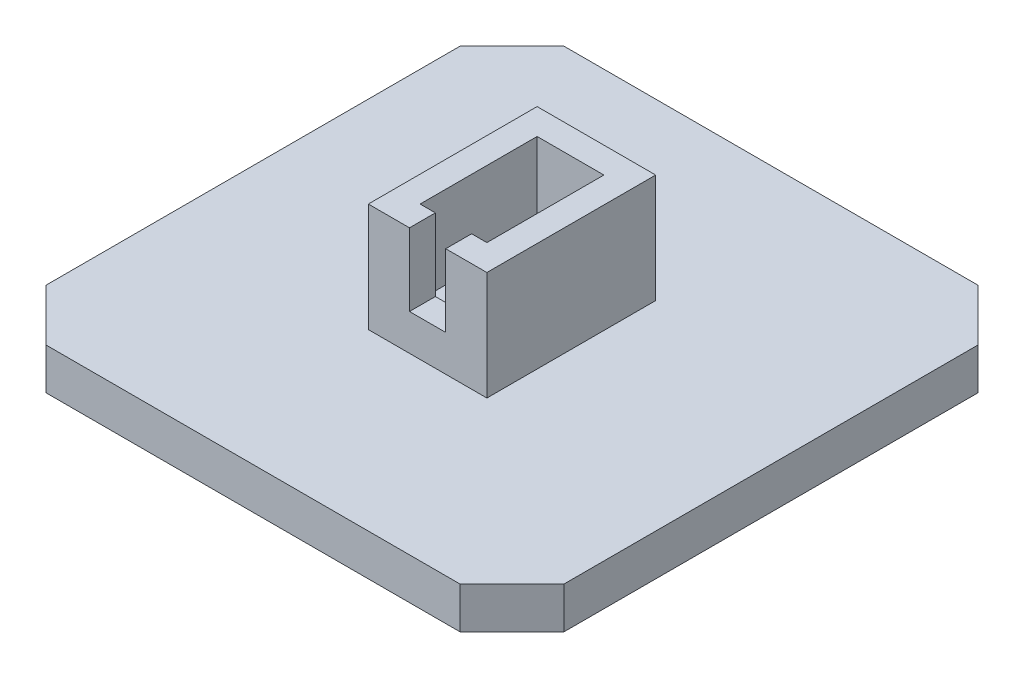
ISO-10303-21;
HEADER;
FILE_DESCRIPTION(('STEP AP214'),'2;1');
FILE_NAME('part.step','',(''),(''),'','','');
FILE_SCHEMA(('AUTOMOTIVE_DESIGN { 1 0 10303 214 1 1 1 1 }'));
ENDSEC;
DATA;
#1=APPLICATION_CONTEXT('core data for automotive mechanical design processes');
#2=APPLICATION_PROTOCOL_DEFINITION('international standard','automotive_design',2000,#1);
#3=PRODUCT_CONTEXT('',#1,'mechanical');
#4=PRODUCT('Part','Part','',(#3));
#5=PRODUCT_RELATED_PRODUCT_CATEGORY('part','',(#4));
#6=PRODUCT_DEFINITION_FORMATION('','',#4);
#7=PRODUCT_DEFINITION_CONTEXT('part definition',#1,'design');
#8=PRODUCT_DEFINITION('design','',#6,#7);
#9=PRODUCT_DEFINITION_SHAPE('','',#8);
#10=(LENGTH_UNIT() NAMED_UNIT(*) SI_UNIT(.MILLI.,.METRE.));
#11=(NAMED_UNIT(*) PLANE_ANGLE_UNIT() SI_UNIT($,.RADIAN.));
#12=(NAMED_UNIT(*) SI_UNIT($,.STERADIAN.) SOLID_ANGLE_UNIT());
#13=UNCERTAINTY_MEASURE_WITH_UNIT(LENGTH_MEASURE(1.E-05),#10,'distance_accuracy_value','');
#14=(GEOMETRIC_REPRESENTATION_CONTEXT(3) GLOBAL_UNCERTAINTY_ASSIGNED_CONTEXT((#13)) GLOBAL_UNIT_ASSIGNED_CONTEXT((#10,
#11,#12)) REPRESENTATION_CONTEXT('',''));
#15=CARTESIAN_POINT('',(0.,0.,0.));
#16=DIRECTION('',(0.,0.,1.));
#17=DIRECTION('',(1.,0.,0.));
#18=AXIS2_PLACEMENT_3D('',#15,#16,#17);
#19=CARTESIAN_POINT('',(6.45,7.99999999999999,11.3));
#20=DIRECTION('',(0.,-1.,0.));
#21=DIRECTION('',(0.,0.,-1.));
#22=AXIS2_PLACEMENT_3D('',#19,#20,#21);
#23=PLANE('',#22);
#24=DIRECTION('',(-1.,0.,0.));
#25=VECTOR('',#24,1.);
#26=CARTESIAN_POINT('',(6.45,7.99999999999999,16.3));
#27=LINE('',#26,#25);
#28=CARTESIAN_POINT('',(-3.5,7.99999999999999,16.3));
#29=VERTEX_POINT('',#28);
#30=CARTESIAN_POINT('',(-11.45,7.99999999999999,16.3));
#31=VERTEX_POINT('',#30);
#32=EDGE_CURVE('E201',#29,#31,#27,.T.);
#33=ORIENTED_EDGE('',*,*,#32,.F.);
#34=DIRECTION('',(0.,0.,-1.));
#35=VECTOR('',#34,1.);
#36=CARTESIAN_POINT('',(-3.5,7.99999999999999,16.301));
#37=LINE('',#36,#35);
#38=CARTESIAN_POINT('',(-3.5,7.99999999999999,11.3));
#39=VERTEX_POINT('',#38);
#40=EDGE_CURVE('E293',#29,#39,#37,.T.);
#41=ORIENTED_EDGE('',*,*,#40,.T.);
#42=DIRECTION('',(-1.,0.,0.));
#43=VECTOR('',#42,1.);
#44=CARTESIAN_POINT('',(6.45,7.99999999999999,11.3));
#45=LINE('',#44,#43);
#46=CARTESIAN_POINT('',(-6.45,7.99999999999999,11.3));
#47=VERTEX_POINT('',#46);
#48=EDGE_CURVE('E329',#39,#47,#45,.T.);
#49=ORIENTED_EDGE('',*,*,#48,.T.);
#50=DIRECTION('',(0.,0.,1.));
#51=VECTOR('',#50,1.);
#52=CARTESIAN_POINT('',(-6.45,7.99999999999999,11.3));
#53=LINE('',#52,#51);
#54=CARTESIAN_POINT('',(-6.45,7.99999999999999,-11.3));
#55=VERTEX_POINT('',#54);
#56=EDGE_CURVE('E317',#55,#47,#53,.T.);
#57=ORIENTED_EDGE('',*,*,#56,.F.);
#58=DIRECTION('',(-1.,0.,0.));
#59=VECTOR('',#58,1.);
#60=CARTESIAN_POINT('',(6.45,7.99999999999999,-11.3));
#61=LINE('',#60,#59);
#62=CARTESIAN_POINT('',(6.45,7.99999999999999,-11.3));
#63=VERTEX_POINT('',#62);
#64=EDGE_CURVE('E331',#63,#55,#61,.T.);
#65=ORIENTED_EDGE('',*,*,#64,.F.);
#66=DIRECTION('',(0.,0.,1.));
#67=VECTOR('',#66,1.);
#68=CARTESIAN_POINT('',(6.45,7.99999999999999,11.3));
#69=LINE('',#68,#67);
#70=CARTESIAN_POINT('',(6.45,7.99999999999999,11.3));
#71=VERTEX_POINT('',#70);
#72=EDGE_CURVE('E306',#63,#71,#69,.T.);
#73=ORIENTED_EDGE('',*,*,#72,.T.);
#74=CARTESIAN_POINT('',(3.5,7.99999999999999,11.3));
#75=VERTEX_POINT('',#74);
#76=EDGE_CURVE('E332',#71,#75,#45,.T.);
#77=ORIENTED_EDGE('',*,*,#76,.T.);
#78=DIRECTION('',(0.,0.,-1.));
#79=VECTOR('',#78,1.);
#80=CARTESIAN_POINT('',(3.5,7.99999999999999,16.301));
#81=LINE('',#80,#79);
#82=CARTESIAN_POINT('',(3.5,7.99999999999999,16.3));
#83=VERTEX_POINT('',#82);
#84=EDGE_CURVE('E297',#83,#75,#81,.T.);
#85=ORIENTED_EDGE('',*,*,#84,.F.);
#86=CARTESIAN_POINT('',(11.45,7.99999999999999,16.3));
#87=VERTEX_POINT('',#86);
#88=EDGE_CURVE('E215',#87,#83,#27,.T.);
#89=ORIENTED_EDGE('',*,*,#88,.F.);
#90=DIRECTION('',(0.,0.,1.));
#91=VECTOR('',#90,1.);
#92=CARTESIAN_POINT('',(11.45,7.99999999999999,0.));
#93=LINE('',#92,#91);
#94=CARTESIAN_POINT('',(11.45,7.99999999999999,-16.3));
#95=VERTEX_POINT('',#94);
#96=EDGE_CURVE('E218',#95,#87,#93,.T.);
#97=ORIENTED_EDGE('',*,*,#96,.F.);
#98=DIRECTION('',(-1.,0.,0.));
#99=VECTOR('',#98,1.);
#100=CARTESIAN_POINT('',(6.45,7.99999999999999,-16.3));
#101=LINE('',#100,#99);
#102=CARTESIAN_POINT('',(-11.45,7.99999999999999,-16.3));
#103=VERTEX_POINT('',#102);
#104=EDGE_CURVE('E219',#95,#103,#101,.T.);
#105=ORIENTED_EDGE('',*,*,#104,.T.);
#106=DIRECTION('',(0.,0.,1.));
#107=VECTOR('',#106,1.);
#108=CARTESIAN_POINT('',(-11.45,7.99999999999999,0.));
#109=LINE('',#108,#107);
#110=EDGE_CURVE('E202',#103,#31,#109,.T.);
#111=ORIENTED_EDGE('',*,*,#110,.T.);
#112=EDGE_LOOP('',(#33,#41,#49,#57,#65,#73,#77,#85,#89,#97,#105,#111));
#113=FACE_BOUND('',#112,.T.);
#114=ADVANCED_FACE('F43',(#113),#23,.F.);
#115=CARTESIAN_POINT('',(6.45,-8.00000000000001,-16.3));
#116=DIRECTION('',(0.,0.,1.));
#117=DIRECTION('',(1.,0.,0.));
#118=AXIS2_PLACEMENT_3D('',#115,#116,#117);
#119=PLANE('',#118);
#120=DIRECTION('',(0.,1.,0.));
#121=VECTOR('',#120,1.);
#122=CARTESIAN_POINT('',(-11.45,0.,-16.3));
#123=LINE('',#122,#121);
#124=CARTESIAN_POINT('',(-11.45,-13.,-16.3));
#125=VERTEX_POINT('',#124);
#126=EDGE_CURVE('E187',#125,#103,#123,.T.);
#127=ORIENTED_EDGE('',*,*,#126,.T.);
#128=ORIENTED_EDGE('',*,*,#104,.F.);
#129=DIRECTION('',(0.,1.,0.));
#130=VECTOR('',#129,1.);
#131=CARTESIAN_POINT('',(11.45,0.,-16.3));
#132=LINE('',#131,#130);
#133=CARTESIAN_POINT('',(11.45,-13.,-16.3));
#134=VERTEX_POINT('',#133);
#135=EDGE_CURVE('E194',#134,#95,#132,.T.);
#136=ORIENTED_EDGE('',*,*,#135,.F.);
#137=DIRECTION('',(-1.,0.,0.));
#138=VECTOR('',#137,1.);
#139=CARTESIAN_POINT('',(6.45,-13.,-16.3));
#140=LINE('',#139,#138);
#141=EDGE_CURVE('E209',#134,#125,#140,.T.);
#142=ORIENTED_EDGE('',*,*,#141,.T.);
#143=EDGE_LOOP('',(#127,#128,#136,#142));
#144=FACE_BOUND('',#143,.T.);
#145=ADVANCED_FACE('F345',(#144),#119,.F.);
#146=CARTESIAN_POINT('',(6.45,-8.00000000000001,16.3));
#147=DIRECTION('',(0.,0.,-1.));
#148=DIRECTION('',(-1.,0.,0.));
#149=AXIS2_PLACEMENT_3D('',#146,#147,#148);
#150=PLANE('',#149);
#151=DIRECTION('',(-1.,0.,0.));
#152=VECTOR('',#151,1.);
#153=CARTESIAN_POINT('',(-3.5,-6.00000000000001,16.3));
#154=LINE('',#153,#152);
#155=CARTESIAN_POINT('',(3.5,-6.00000000000001,16.3));
#156=VERTEX_POINT('',#155);
#157=CARTESIAN_POINT('',(-3.5,-6.00000000000001,16.3));
#158=VERTEX_POINT('',#157);
#159=EDGE_CURVE('E292',#156,#158,#154,.T.);
#160=ORIENTED_EDGE('',*,*,#159,.T.);
#161=DIRECTION('',(0.,1.,0.));
#162=VECTOR('',#161,1.);
#163=CARTESIAN_POINT('',(-3.5,-6.00000000000001,16.3));
#164=LINE('',#163,#162);
#165=EDGE_CURVE('E291',#158,#29,#164,.T.);
#166=ORIENTED_EDGE('',*,*,#165,.T.);
#167=ORIENTED_EDGE('',*,*,#32,.T.);
#168=DIRECTION('',(0.,-1.,0.));
#169=VECTOR('',#168,1.);
#170=CARTESIAN_POINT('',(-11.45,0.,16.3));
#171=LINE('',#170,#169);
#172=CARTESIAN_POINT('',(-11.45,-13.,16.3));
#173=VERTEX_POINT('',#172);
#174=EDGE_CURVE('E188',#31,#173,#171,.T.);
#175=ORIENTED_EDGE('',*,*,#174,.T.);
#176=DIRECTION('',(-1.,0.,0.));
#177=VECTOR('',#176,1.);
#178=CARTESIAN_POINT('',(6.45,-13.,16.3));
#179=LINE('',#178,#177);
#180=CARTESIAN_POINT('',(11.45,-13.,16.3));
#181=VERTEX_POINT('',#180);
#182=EDGE_CURVE('E200',#181,#173,#179,.T.);
#183=ORIENTED_EDGE('',*,*,#182,.F.);
#184=DIRECTION('',(0.,-1.,0.));
#185=VECTOR('',#184,1.);
#186=CARTESIAN_POINT('',(11.45,0.,16.3));
#187=LINE('',#186,#185);
#188=EDGE_CURVE('E220',#87,#181,#187,.T.);
#189=ORIENTED_EDGE('',*,*,#188,.F.);
#190=ORIENTED_EDGE('',*,*,#88,.T.);
#191=DIRECTION('',(0.,-1.,0.));
#192=VECTOR('',#191,1.);
#193=CARTESIAN_POINT('',(3.5,-6.00000000000001,16.3));
#194=LINE('',#193,#192);
#195=EDGE_CURVE('E287',#83,#156,#194,.T.);
#196=ORIENTED_EDGE('',*,*,#195,.T.);
#197=EDGE_LOOP('',(#160,#166,#167,#175,#183,#189,#190,#196));
#198=FACE_BOUND('',#197,.T.);
#199=ADVANCED_FACE('F197',(#198),#150,.F.);
#200=CARTESIAN_POINT('',(11.45,0.,0.));
#201=DIRECTION('',(-1.,0.,0.));
#202=DIRECTION('',(0.,0.,1.));
#203=AXIS2_PLACEMENT_3D('',#200,#201,#202);
#204=PLANE('',#203);
#205=ORIENTED_EDGE('',*,*,#135,.T.);
#206=ORIENTED_EDGE('',*,*,#96,.T.);
#207=ORIENTED_EDGE('',*,*,#188,.T.);
#208=DIRECTION('',(0.,0.,-1.));
#209=VECTOR('',#208,1.);
#210=CARTESIAN_POINT('',(11.45,-13.,0.));
#211=LINE('',#210,#209);
#212=EDGE_CURVE('E207',#181,#134,#211,.T.);
#213=ORIENTED_EDGE('',*,*,#212,.T.);
#214=EDGE_LOOP('',(#205,#206,#207,#213));
#215=FACE_BOUND('',#214,.T.);
#216=ADVANCED_FACE('F343',(#215),#204,.F.);
#217=CARTESIAN_POINT('',(-11.45,0.,0.));
#218=DIRECTION('',(-1.,0.,0.));
#219=DIRECTION('',(0.,0.,1.));
#220=AXIS2_PLACEMENT_3D('',#217,#218,#219);
#221=PLANE('',#220);
#222=ORIENTED_EDGE('',*,*,#126,.F.);
#223=DIRECTION('',(0.,0.,-1.));
#224=VECTOR('',#223,1.);
#225=CARTESIAN_POINT('',(-11.45,-13.,0.));
#226=LINE('',#225,#224);
#227=EDGE_CURVE('E181',#173,#125,#226,.T.);
#228=ORIENTED_EDGE('',*,*,#227,.F.);
#229=ORIENTED_EDGE('',*,*,#174,.F.);
#230=ORIENTED_EDGE('',*,*,#110,.F.);
#231=EDGE_LOOP('',(#222,#228,#229,#230));
#232=FACE_BOUND('',#231,.T.);
#233=ADVANCED_FACE('F183',(#232),#221,.T.);
#234=CARTESIAN_POINT('',(6.45,-8.00000000000001,-11.3));
#235=DIRECTION('',(0.,0.,1.));
#236=DIRECTION('',(1.,0.,0.));
#237=AXIS2_PLACEMENT_3D('',#234,#235,#236);
#238=PLANE('',#237);
#239=DIRECTION('',(0.,1.,0.));
#240=VECTOR('',#239,1.);
#241=CARTESIAN_POINT('',(-6.45,-8.00000000000001,-11.3));
#242=LINE('',#241,#240);
#243=CARTESIAN_POINT('',(-6.45,-8.00000000000001,-11.3));
#244=VERTEX_POINT('',#243);
#245=EDGE_CURVE('E301',#244,#55,#242,.T.);
#246=ORIENTED_EDGE('',*,*,#245,.F.);
#247=DIRECTION('',(-1.,0.,0.));
#248=VECTOR('',#247,1.);
#249=CARTESIAN_POINT('',(6.45,-8.00000000000001,-11.3));
#250=LINE('',#249,#248);
#251=CARTESIAN_POINT('',(6.45,-8.00000000000001,-11.3));
#252=VERTEX_POINT('',#251);
#253=EDGE_CURVE('E316',#252,#244,#250,.T.);
#254=ORIENTED_EDGE('',*,*,#253,.F.);
#255=DIRECTION('',(0.,1.,0.));
#256=VECTOR('',#255,1.);
#257=CARTESIAN_POINT('',(6.45,-8.00000000000001,-11.3));
#258=LINE('',#257,#256);
#259=EDGE_CURVE('E308',#252,#63,#258,.T.);
#260=ORIENTED_EDGE('',*,*,#259,.T.);
#261=ORIENTED_EDGE('',*,*,#64,.T.);
#262=EDGE_LOOP('',(#246,#254,#260,#261));
#263=FACE_BOUND('',#262,.T.);
#264=ADVANCED_FACE('F376',(#263),#238,.T.);
#265=CARTESIAN_POINT('',(6.45,-8.00000000000001,11.3));
#266=DIRECTION('',(0.,0.,-1.));
#267=DIRECTION('',(-1.,0.,0.));
#268=AXIS2_PLACEMENT_3D('',#265,#266,#267);
#269=PLANE('',#268);
#270=DIRECTION('',(0.,1.,0.));
#271=VECTOR('',#270,1.);
#272=CARTESIAN_POINT('',(-3.5,-6.00000000000001,11.3));
#273=LINE('',#272,#271);
#274=CARTESIAN_POINT('',(-3.5,-6.00000000000001,11.3));
#275=VERTEX_POINT('',#274);
#276=EDGE_CURVE('E288',#275,#39,#273,.T.);
#277=ORIENTED_EDGE('',*,*,#276,.F.);
#278=DIRECTION('',(-1.,0.,0.));
#279=VECTOR('',#278,1.);
#280=CARTESIAN_POINT('',(-3.5,-6.00000000000001,11.3));
#281=LINE('',#280,#279);
#282=CARTESIAN_POINT('',(3.5,-6.00000000000001,11.3));
#283=VERTEX_POINT('',#282);
#284=EDGE_CURVE('E284',#283,#275,#281,.T.);
#285=ORIENTED_EDGE('',*,*,#284,.F.);
#286=DIRECTION('',(0.,-1.,0.));
#287=VECTOR('',#286,1.);
#288=CARTESIAN_POINT('',(3.5,-6.00000000000001,11.3));
#289=LINE('',#288,#287);
#290=EDGE_CURVE('E278',#75,#283,#289,.T.);
#291=ORIENTED_EDGE('',*,*,#290,.F.);
#292=ORIENTED_EDGE('',*,*,#76,.F.);
#293=DIRECTION('',(0.,-1.,0.));
#294=VECTOR('',#293,1.);
#295=CARTESIAN_POINT('',(6.45,-8.00000000000001,11.3));
#296=LINE('',#295,#294);
#297=CARTESIAN_POINT('',(6.45,-8.00000000000001,11.3));
#298=VERTEX_POINT('',#297);
#299=EDGE_CURVE('E315',#71,#298,#296,.T.);
#300=ORIENTED_EDGE('',*,*,#299,.T.);
#301=DIRECTION('',(-1.,0.,0.));
#302=VECTOR('',#301,1.);
#303=CARTESIAN_POINT('',(6.45,-8.00000000000001,11.3));
#304=LINE('',#303,#302);
#305=CARTESIAN_POINT('',(-6.45,-8.00000000000001,11.3));
#306=VERTEX_POINT('',#305);
#307=EDGE_CURVE('E330',#298,#306,#304,.T.);
#308=ORIENTED_EDGE('',*,*,#307,.T.);
#309=DIRECTION('',(0.,-1.,0.));
#310=VECTOR('',#309,1.);
#311=CARTESIAN_POINT('',(-6.45,-8.00000000000001,11.3));
#312=LINE('',#311,#310);
#313=EDGE_CURVE('E325',#47,#306,#312,.T.);
#314=ORIENTED_EDGE('',*,*,#313,.F.);
#315=ORIENTED_EDGE('',*,*,#48,.F.);
#316=EDGE_LOOP('',(#277,#285,#291,#292,#300,#308,#314,#315));
#317=FACE_BOUND('',#316,.T.);
#318=ADVANCED_FACE('F359',(#317),#269,.T.);
#319=CARTESIAN_POINT('',(6.45,-8.00000000000001,11.3));
#320=DIRECTION('',(0.,1.,0.));
#321=DIRECTION('',(0.,0.,1.));
#322=AXIS2_PLACEMENT_3D('',#319,#320,#321);
#323=PLANE('',#322);
#324=DIRECTION('',(0.,0.,-1.));
#325=VECTOR('',#324,1.);
#326=CARTESIAN_POINT('',(-6.45,-8.00000000000001,11.3));
#327=LINE('',#326,#325);
#328=EDGE_CURVE('E310',#306,#244,#327,.T.);
#329=ORIENTED_EDGE('',*,*,#328,.F.);
#330=ORIENTED_EDGE('',*,*,#307,.F.);
#331=DIRECTION('',(0.,0.,-1.));
#332=VECTOR('',#331,1.);
#333=CARTESIAN_POINT('',(6.45,-8.00000000000001,11.3));
#334=LINE('',#333,#332);
#335=EDGE_CURVE('E314',#298,#252,#334,.T.);
#336=ORIENTED_EDGE('',*,*,#335,.T.);
#337=ORIENTED_EDGE('',*,*,#253,.T.);
#338=EDGE_LOOP('',(#329,#330,#336,#337));
#339=FACE_BOUND('',#338,.T.);
#340=ADVANCED_FACE('F375',(#339),#323,.T.);
#341=CARTESIAN_POINT('',(6.45,0.,0.));
#342=DIRECTION('',(-1.,0.,0.));
#343=DIRECTION('',(0.,0.,1.));
#344=AXIS2_PLACEMENT_3D('',#341,#342,#343);
#345=PLANE('',#344);
#346=ORIENTED_EDGE('',*,*,#259,.F.);
#347=ORIENTED_EDGE('',*,*,#335,.F.);
#348=ORIENTED_EDGE('',*,*,#299,.F.);
#349=ORIENTED_EDGE('',*,*,#72,.F.);
#350=EDGE_LOOP('',(#346,#347,#348,#349));
#351=FACE_BOUND('',#350,.T.);
#352=ADVANCED_FACE('F377',(#351),#345,.T.);
#353=CARTESIAN_POINT('',(-6.45,0.,0.));
#354=DIRECTION('',(-1.,0.,0.));
#355=DIRECTION('',(0.,0.,1.));
#356=AXIS2_PLACEMENT_3D('',#353,#354,#355);
#357=PLANE('',#356);
#358=ORIENTED_EDGE('',*,*,#245,.T.);
#359=ORIENTED_EDGE('',*,*,#56,.T.);
#360=ORIENTED_EDGE('',*,*,#313,.T.);
#361=ORIENTED_EDGE('',*,*,#328,.T.);
#362=EDGE_LOOP('',(#358,#359,#360,#361));
#363=FACE_BOUND('',#362,.T.);
#364=ADVANCED_FACE('F364',(#363),#357,.F.);
#365=CARTESIAN_POINT('',(-3.5,-6.00000000000001,16.301));
#366=DIRECTION('',(1.,0.,0.));
#367=DIRECTION('',(0.,0.,-1.));
#368=AXIS2_PLACEMENT_3D('',#365,#366,#367);
#369=PLANE('',#368);
#370=DIRECTION('',(0.,0.,-1.));
#371=VECTOR('',#370,1.);
#372=CARTESIAN_POINT('',(-3.5,-6.00000000000001,16.301));
#373=LINE('',#372,#371);
#374=EDGE_CURVE('E302',#158,#275,#373,.T.);
#375=ORIENTED_EDGE('',*,*,#374,.T.);
#376=ORIENTED_EDGE('',*,*,#276,.T.);
#377=ORIENTED_EDGE('',*,*,#40,.F.);
#378=ORIENTED_EDGE('',*,*,#165,.F.);
#379=EDGE_LOOP('',(#375,#376,#377,#378));
#380=FACE_BOUND('',#379,.T.);
#381=ADVANCED_FACE('F363',(#380),#369,.T.);
#382=CARTESIAN_POINT('',(-3.5,-6.00000000000001,16.301));
#383=DIRECTION('',(0.,1.,0.));
#384=DIRECTION('',(-1.,0.,0.));
#385=AXIS2_PLACEMENT_3D('',#382,#383,#384);
#386=PLANE('',#385);
#387=DIRECTION('',(0.,0.,-1.));
#388=VECTOR('',#387,1.);
#389=CARTESIAN_POINT('',(3.5,-6.00000000000001,16.301));
#390=LINE('',#389,#388);
#391=EDGE_CURVE('E296',#156,#283,#390,.T.);
#392=ORIENTED_EDGE('',*,*,#391,.T.);
#393=ORIENTED_EDGE('',*,*,#284,.T.);
#394=ORIENTED_EDGE('',*,*,#374,.F.);
#395=ORIENTED_EDGE('',*,*,#159,.F.);
#396=EDGE_LOOP('',(#392,#393,#394,#395));
#397=FACE_BOUND('',#396,.T.);
#398=ADVANCED_FACE('F352',(#397),#386,.T.);
#399=CARTESIAN_POINT('',(3.5,-6.00000000000001,16.301));
#400=DIRECTION('',(-1.,0.,0.));
#401=DIRECTION('',(0.,-1.,0.));
#402=AXIS2_PLACEMENT_3D('',#399,#400,#401);
#403=PLANE('',#402);
#404=ORIENTED_EDGE('',*,*,#84,.T.);
#405=ORIENTED_EDGE('',*,*,#290,.T.);
#406=ORIENTED_EDGE('',*,*,#391,.F.);
#407=ORIENTED_EDGE('',*,*,#195,.F.);
#408=EDGE_LOOP('',(#404,#405,#406,#407));
#409=FACE_BOUND('',#408,.T.);
#410=ADVANCED_FACE('F349',(#409),#403,.T.);
#411=CARTESIAN_POINT('',(50.,-21.,-50.));
#412=DIRECTION('',(-1.,0.,0.));
#413=DIRECTION('',(0.,0.,1.));
#414=AXIS2_PLACEMENT_3D('',#411,#412,#413);
#415=PLANE('',#414);
#416=DIRECTION('',(0.,0.,1.));
#417=VECTOR('',#416,1.);
#418=CARTESIAN_POINT('',(50.,-21.,-50.));
#419=LINE('',#418,#417);
#420=CARTESIAN_POINT('',(50.,-21.,-40.));
#421=VERTEX_POINT('',#420);
#422=CARTESIAN_POINT('',(50.,-21.,40.));
#423=VERTEX_POINT('',#422);
#424=EDGE_CURVE('E276',#421,#423,#419,.T.);
#425=ORIENTED_EDGE('',*,*,#424,.F.);
#426=DIRECTION('',(0.,1.,0.));
#427=VECTOR('',#426,1.);
#428=CARTESIAN_POINT('',(50.,-21.,-40.));
#429=LINE('',#428,#427);
#430=CARTESIAN_POINT('',(50.,-13.,-40.));
#431=VERTEX_POINT('',#430);
#432=EDGE_CURVE('E227',#421,#431,#429,.T.);
#433=ORIENTED_EDGE('',*,*,#432,.T.);
#434=DIRECTION('',(0.,0.,1.));
#435=VECTOR('',#434,1.);
#436=CARTESIAN_POINT('',(50.,-13.,-50.));
#437=LINE('',#436,#435);
#438=CARTESIAN_POINT('',(50.,-13.,40.));
#439=VERTEX_POINT('',#438);
#440=EDGE_CURVE('E269',#431,#439,#437,.T.);
#441=ORIENTED_EDGE('',*,*,#440,.T.);
#442=DIRECTION('',(0.,-1.,0.));
#443=VECTOR('',#442,1.);
#444=CARTESIAN_POINT('',(50.,-21.,40.));
#445=LINE('',#444,#443);
#446=EDGE_CURVE('E224',#439,#423,#445,.T.);
#447=ORIENTED_EDGE('',*,*,#446,.T.);
#448=EDGE_LOOP('',(#425,#433,#441,#447));
#449=FACE_BOUND('',#448,.T.);
#450=ADVANCED_FACE('F447',(#449),#415,.F.);
#451=CARTESIAN_POINT('',(-50.,-21.,50.));
#452=DIRECTION('',(0.,0.,-1.));
#453=DIRECTION('',(-1.,0.,0.));
#454=AXIS2_PLACEMENT_3D('',#451,#452,#453);
#455=PLANE('',#454);
#456=DIRECTION('',(-1.,0.,0.));
#457=VECTOR('',#456,1.);
#458=CARTESIAN_POINT('',(-50.,-13.,50.));
#459=LINE('',#458,#457);
#460=CARTESIAN_POINT('',(40.,-13.,50.));
#461=VERTEX_POINT('',#460);
#462=CARTESIAN_POINT('',(-40.,-13.,50.));
#463=VERTEX_POINT('',#462);
#464=EDGE_CURVE('E261',#461,#463,#459,.T.);
#465=ORIENTED_EDGE('',*,*,#464,.T.);
#466=DIRECTION('',(0.,-1.,0.));
#467=VECTOR('',#466,1.);
#468=CARTESIAN_POINT('',(-40.,-21.,50.));
#469=LINE('',#468,#467);
#470=CARTESIAN_POINT('',(-40.,-21.,50.));
#471=VERTEX_POINT('',#470);
#472=EDGE_CURVE('E11',#463,#471,#469,.T.);
#473=ORIENTED_EDGE('',*,*,#472,.T.);
#474=DIRECTION('',(-1.,0.,0.));
#475=VECTOR('',#474,1.);
#476=CARTESIAN_POINT('',(-50.,-21.,50.));
#477=LINE('',#476,#475);
#478=CARTESIAN_POINT('',(40.,-21.,50.));
#479=VERTEX_POINT('',#478);
#480=EDGE_CURVE('E263',#479,#471,#477,.T.);
#481=ORIENTED_EDGE('',*,*,#480,.F.);
#482=DIRECTION('',(0.,1.,0.));
#483=VECTOR('',#482,1.);
#484=CARTESIAN_POINT('',(40.,-21.,50.));
#485=LINE('',#484,#483);
#486=EDGE_CURVE('E55',#479,#461,#485,.T.);
#487=ORIENTED_EDGE('',*,*,#486,.T.);
#488=EDGE_LOOP('',(#465,#473,#481,#487));
#489=FACE_BOUND('',#488,.T.);
#490=ADVANCED_FACE('F257',(#489),#455,.F.);
#491=CARTESIAN_POINT('',(-50.,-21.,-50.));
#492=DIRECTION('',(1.,0.,0.));
#493=DIRECTION('',(0.,0.,-1.));
#494=AXIS2_PLACEMENT_3D('',#491,#492,#493);
#495=PLANE('',#494);
#496=DIRECTION('',(0.,0.,-1.));
#497=VECTOR('',#496,1.);
#498=CARTESIAN_POINT('',(-50.,-13.,-50.));
#499=LINE('',#498,#497);
#500=CARTESIAN_POINT('',(-50.,-13.,40.));
#501=VERTEX_POINT('',#500);
#502=CARTESIAN_POINT('',(-50.,-13.,-40.));
#503=VERTEX_POINT('',#502);
#504=EDGE_CURVE('E267',#501,#503,#499,.T.);
#505=ORIENTED_EDGE('',*,*,#504,.T.);
#506=DIRECTION('',(0.,-1.,0.));
#507=VECTOR('',#506,1.);
#508=CARTESIAN_POINT('',(-50.,-21.,-40.));
#509=LINE('',#508,#507);
#510=CARTESIAN_POINT('',(-50.,-21.,-40.));
#511=VERTEX_POINT('',#510);
#512=EDGE_CURVE('E56',#503,#511,#509,.T.);
#513=ORIENTED_EDGE('',*,*,#512,.T.);
#514=DIRECTION('',(0.,0.,-1.));
#515=VECTOR('',#514,1.);
#516=CARTESIAN_POINT('',(-50.,-21.,-50.));
#517=LINE('',#516,#515);
#518=CARTESIAN_POINT('',(-50.,-21.,40.));
#519=VERTEX_POINT('',#518);
#520=EDGE_CURVE('E427',#519,#511,#517,.T.);
#521=ORIENTED_EDGE('',*,*,#520,.F.);
#522=DIRECTION('',(0.,1.,0.));
#523=VECTOR('',#522,1.);
#524=CARTESIAN_POINT('',(-50.,-21.,40.));
#525=LINE('',#524,#523);
#526=EDGE_CURVE('E253',#519,#501,#525,.T.);
#527=ORIENTED_EDGE('',*,*,#526,.T.);
#528=EDGE_LOOP('',(#505,#513,#521,#527));
#529=FACE_BOUND('',#528,.T.);
#530=ADVANCED_FACE('F428',(#529),#495,.F.);
#531=CARTESIAN_POINT('',(-50.,-21.,-50.));
#532=DIRECTION('',(0.,0.,1.));
#533=DIRECTION('',(1.,0.,0.));
#534=AXIS2_PLACEMENT_3D('',#531,#532,#533);
#535=PLANE('',#534);
#536=DIRECTION('',(1.,0.,0.));
#537=VECTOR('',#536,1.);
#538=CARTESIAN_POINT('',(-50.,-13.,-50.));
#539=LINE('',#538,#537);
#540=CARTESIAN_POINT('',(-40.,-13.,-50.));
#541=VERTEX_POINT('',#540);
#542=CARTESIAN_POINT('',(40.,-13.,-50.));
#543=VERTEX_POINT('',#542);
#544=EDGE_CURVE('E275',#541,#543,#539,.T.);
#545=ORIENTED_EDGE('',*,*,#544,.T.);
#546=DIRECTION('',(0.,-1.,0.));
#547=VECTOR('',#546,1.);
#548=CARTESIAN_POINT('',(40.,-21.,-50.));
#549=LINE('',#548,#547);
#550=CARTESIAN_POINT('',(40.,-21.,-50.));
#551=VERTEX_POINT('',#550);
#552=EDGE_CURVE('E244',#543,#551,#549,.T.);
#553=ORIENTED_EDGE('',*,*,#552,.T.);
#554=DIRECTION('',(1.,0.,0.));
#555=VECTOR('',#554,1.);
#556=CARTESIAN_POINT('',(-50.,-21.,-50.));
#557=LINE('',#556,#555);
#558=CARTESIAN_POINT('',(-40.,-21.,-50.));
#559=VERTEX_POINT('',#558);
#560=EDGE_CURVE('E282',#559,#551,#557,.T.);
#561=ORIENTED_EDGE('',*,*,#560,.F.);
#562=DIRECTION('',(0.,1.,0.));
#563=VECTOR('',#562,1.);
#564=CARTESIAN_POINT('',(-40.,-21.,-50.));
#565=LINE('',#564,#563);
#566=EDGE_CURVE('E239',#559,#541,#565,.T.);
#567=ORIENTED_EDGE('',*,*,#566,.T.);
#568=EDGE_LOOP('',(#545,#553,#561,#567));
#569=FACE_BOUND('',#568,.T.);
#570=ADVANCED_FACE('F434',(#569),#535,.F.);
#571=CARTESIAN_POINT('',(0.,-21.,0.));
#572=DIRECTION('',(0.,1.,0.));
#573=DIRECTION('',(0.,0.,1.));
#574=AXIS2_PLACEMENT_3D('',#571,#572,#573);
#575=PLANE('',#574);
#576=ORIENTED_EDGE('',*,*,#560,.T.);
#577=DIRECTION('',(-0.707106781186549,0.,-0.707106781186547));
#578=VECTOR('',#577,1.);
#579=CARTESIAN_POINT('',(50.,-21.,-40.));
#580=LINE('',#579,#578);
#581=EDGE_CURVE('E250',#551,#421,#580,.F.);
#582=ORIENTED_EDGE('',*,*,#581,.T.);
#583=ORIENTED_EDGE('',*,*,#424,.T.);
#584=DIRECTION('',(0.707106781186547,0.,-0.707106781186549));
#585=VECTOR('',#584,1.);
#586=CARTESIAN_POINT('',(40.,-21.,50.));
#587=LINE('',#586,#585);
#588=EDGE_CURVE('E245',#423,#479,#587,.F.);
#589=ORIENTED_EDGE('',*,*,#588,.T.);
#590=ORIENTED_EDGE('',*,*,#480,.T.);
#591=DIRECTION('',(0.707106781186549,0.,0.707106781186547));
#592=VECTOR('',#591,1.);
#593=CARTESIAN_POINT('',(-50.,-21.,40.));
#594=LINE('',#593,#592);
#595=EDGE_CURVE('E68',#471,#519,#594,.F.);
#596=ORIENTED_EDGE('',*,*,#595,.T.);
#597=ORIENTED_EDGE('',*,*,#520,.T.);
#598=DIRECTION('',(-0.707106781186547,0.,0.707106781186549));
#599=VECTOR('',#598,1.);
#600=CARTESIAN_POINT('',(-40.,-21.,-50.));
#601=LINE('',#600,#599);
#602=EDGE_CURVE('E249',#511,#559,#601,.F.);
#603=ORIENTED_EDGE('',*,*,#602,.T.);
#604=EDGE_LOOP('',(#576,#582,#583,#589,#590,#596,#597,#603));
#605=FACE_BOUND('',#604,.T.);
#606=ADVANCED_FACE('F441',(#605),#575,.F.);
#607=CARTESIAN_POINT('',(0.,-13.,0.));
#608=DIRECTION('',(0.,1.,0.));
#609=DIRECTION('',(0.,0.,1.));
#610=AXIS2_PLACEMENT_3D('',#607,#608,#609);
#611=PLANE('',#610);
#612=ORIENTED_EDGE('',*,*,#182,.T.);
#613=ORIENTED_EDGE('',*,*,#227,.T.);
#614=ORIENTED_EDGE('',*,*,#141,.F.);
#615=ORIENTED_EDGE('',*,*,#212,.F.);
#616=EDGE_LOOP('',(#612,#613,#614,#615));
#617=FACE_BOUND('',#616,.T.);
#618=ORIENTED_EDGE('',*,*,#440,.F.);
#619=DIRECTION('',(0.707106781186549,0.,0.707106781186547));
#620=VECTOR('',#619,1.);
#621=CARTESIAN_POINT('',(44.9999999999999,-13.,-45.0000000000001));
#622=LINE('',#621,#620);
#623=EDGE_CURVE('E240',#431,#543,#622,.F.);
#624=ORIENTED_EDGE('',*,*,#623,.T.);
#625=ORIENTED_EDGE('',*,*,#544,.F.);
#626=DIRECTION('',(0.707106781186547,0.,-0.707106781186549));
#627=VECTOR('',#626,1.);
#628=CARTESIAN_POINT('',(-45.0000000000001,-13.,-44.9999999999999));
#629=LINE('',#628,#627);
#630=EDGE_CURVE('E231',#541,#503,#629,.F.);
#631=ORIENTED_EDGE('',*,*,#630,.T.);
#632=ORIENTED_EDGE('',*,*,#504,.F.);
#633=DIRECTION('',(-0.707106781186549,0.,-0.707106781186547));
#634=VECTOR('',#633,1.);
#635=CARTESIAN_POINT('',(-44.9999999999999,-13.,45.0000000000001));
#636=LINE('',#635,#634);
#637=EDGE_CURVE('E232',#501,#463,#636,.F.);
#638=ORIENTED_EDGE('',*,*,#637,.T.);
#639=ORIENTED_EDGE('',*,*,#464,.F.);
#640=DIRECTION('',(-0.707106781186547,0.,0.707106781186549));
#641=VECTOR('',#640,1.);
#642=CARTESIAN_POINT('',(45.0000000000001,-13.,44.9999999999999));
#643=LINE('',#642,#641);
#644=EDGE_CURVE('E233',#461,#439,#643,.F.);
#645=ORIENTED_EDGE('',*,*,#644,.T.);
#646=EDGE_LOOP('',(#618,#624,#625,#631,#632,#638,#639,#645));
#647=FACE_BOUND('',#646,.T.);
#648=ADVANCED_FACE('F210',(#617,#647),#611,.T.);
#649=CARTESIAN_POINT('',(50.,-21.,-40.));
#650=DIRECTION('',(-0.707106781186546,0.,0.707106781186548));
#651=DIRECTION('',(0.,1.,0.));
#652=AXIS2_PLACEMENT_3D('',#649,#650,#651);
#653=PLANE('',#652);
#654=ORIENTED_EDGE('',*,*,#581,.F.);
#655=ORIENTED_EDGE('',*,*,#552,.F.);
#656=ORIENTED_EDGE('',*,*,#623,.F.);
#657=ORIENTED_EDGE('',*,*,#432,.F.);
#658=EDGE_LOOP('',(#654,#655,#656,#657));
#659=FACE_BOUND('',#658,.T.);
#660=ADVANCED_FACE('F408',(#659),#653,.F.);
#661=CARTESIAN_POINT('',(-40.,-21.,-50.));
#662=DIRECTION('',(0.707106781186548,0.,0.707106781186546));
#663=DIRECTION('',(0.,1.,0.));
#664=AXIS2_PLACEMENT_3D('',#661,#662,#663);
#665=PLANE('',#664);
#666=ORIENTED_EDGE('',*,*,#602,.F.);
#667=ORIENTED_EDGE('',*,*,#512,.F.);
#668=ORIENTED_EDGE('',*,*,#630,.F.);
#669=ORIENTED_EDGE('',*,*,#566,.F.);
#670=EDGE_LOOP('',(#666,#667,#668,#669));
#671=FACE_BOUND('',#670,.T.);
#672=ADVANCED_FACE('F414',(#671),#665,.F.);
#673=CARTESIAN_POINT('',(-50.,-21.,40.));
#674=DIRECTION('',(0.707106781186546,0.,-0.707106781186548));
#675=DIRECTION('',(0.,1.,0.));
#676=AXIS2_PLACEMENT_3D('',#673,#674,#675);
#677=PLANE('',#676);
#678=ORIENTED_EDGE('',*,*,#595,.F.);
#679=ORIENTED_EDGE('',*,*,#472,.F.);
#680=ORIENTED_EDGE('',*,*,#637,.F.);
#681=ORIENTED_EDGE('',*,*,#526,.F.);
#682=EDGE_LOOP('',(#678,#679,#680,#681));
#683=FACE_BOUND('',#682,.T.);
#684=ADVANCED_FACE('F416',(#683),#677,.F.);
#685=CARTESIAN_POINT('',(40.,-21.,50.));
#686=DIRECTION('',(-0.707106781186548,0.,-0.707106781186546));
#687=DIRECTION('',(0.,1.,0.));
#688=AXIS2_PLACEMENT_3D('',#685,#686,#687);
#689=PLANE('',#688);
#690=ORIENTED_EDGE('',*,*,#588,.F.);
#691=ORIENTED_EDGE('',*,*,#446,.F.);
#692=ORIENTED_EDGE('',*,*,#644,.F.);
#693=ORIENTED_EDGE('',*,*,#486,.F.);
#694=EDGE_LOOP('',(#690,#691,#692,#693));
#695=FACE_BOUND('',#694,.T.);
#696=ADVANCED_FACE('F46',(#695),#689,.F.);
#697=CLOSED_SHELL('',(#114,#145,#199,#216,#233,#264,#318,#340,#352,#364,#381,#398,#410,#450,
#490,#530,#570,#606,#648,#660,#672,#684,#696));
#698=MANIFOLD_SOLID_BREP('B2',#697);
#699=ADVANCED_BREP_SHAPE_REPRESENTATION('',(#18,#698),#14);
#700=SHAPE_DEFINITION_REPRESENTATION(#9,#699);
ENDSEC;
END-ISO-10303-21;
